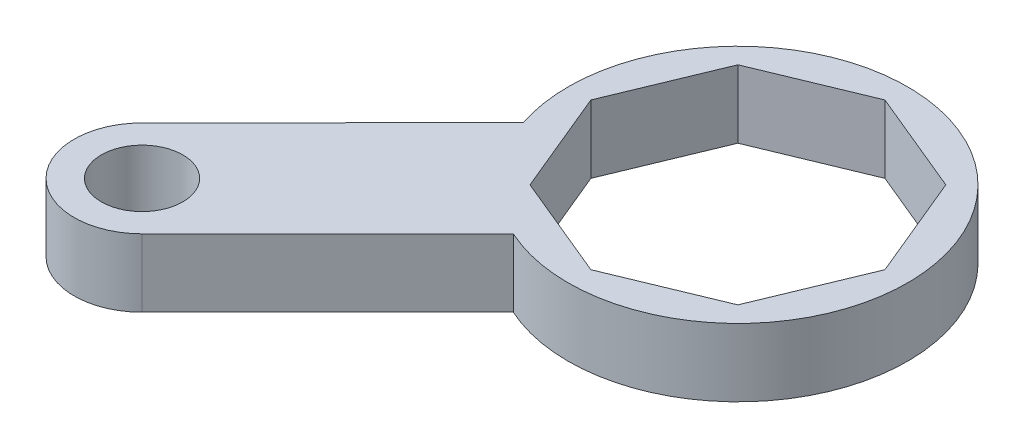
ISO-10303-21;
HEADER;
FILE_DESCRIPTION(('STEP AP214'),'2;1');
FILE_NAME('part.step','',(''),(''),'','','');
FILE_SCHEMA(('AUTOMOTIVE_DESIGN { 1 0 10303 214 1 1 1 1 }'));
ENDSEC;
DATA;
#1=APPLICATION_CONTEXT('core data for automotive mechanical design processes');
#2=APPLICATION_PROTOCOL_DEFINITION('international standard','automotive_design',2000,#1);
#3=PRODUCT_CONTEXT('',#1,'mechanical');
#4=PRODUCT('Part','Part','',(#3));
#5=PRODUCT_RELATED_PRODUCT_CATEGORY('part','',(#4));
#6=PRODUCT_DEFINITION_FORMATION('','',#4);
#7=PRODUCT_DEFINITION_CONTEXT('part definition',#1,'design');
#8=PRODUCT_DEFINITION('design','',#6,#7);
#9=PRODUCT_DEFINITION_SHAPE('','',#8);
#10=(LENGTH_UNIT() NAMED_UNIT(*) SI_UNIT(.MILLI.,.METRE.));
#11=(NAMED_UNIT(*) PLANE_ANGLE_UNIT() SI_UNIT($,.RADIAN.));
#12=(NAMED_UNIT(*) SI_UNIT($,.STERADIAN.) SOLID_ANGLE_UNIT());
#13=UNCERTAINTY_MEASURE_WITH_UNIT(LENGTH_MEASURE(1.E-05),#10,'distance_accuracy_value','');
#14=(GEOMETRIC_REPRESENTATION_CONTEXT(3) GLOBAL_UNCERTAINTY_ASSIGNED_CONTEXT((#13)) GLOBAL_UNIT_ASSIGNED_CONTEXT((#10,
#11,#12)) REPRESENTATION_CONTEXT('',''));
#15=CARTESIAN_POINT('',(0.,0.,0.));
#16=DIRECTION('',(0.,0.,1.));
#17=DIRECTION('',(1.,0.,0.));
#18=AXIS2_PLACEMENT_3D('',#15,#16,#17);
#19=CARTESIAN_POINT('',(-22.3463313526983,5.,21.5224767940391));
#20=DIRECTION('',(0.,1.,0.));
#21=DIRECTION('',(0.,0.,1.));
#22=AXIS2_PLACEMENT_3D('',#19,#20,#21);
#23=PLANE('',#22);
#24=CARTESIAN_POINT('',(-22.3463313526983,5.,21.5224767940391));
#25=DIRECTION('',(0.,1.,0.));
#26=DIRECTION('',(0.,0.,1.));
#27=AXIS2_PLACEMENT_3D('',#24,#25,#26);
#28=CIRCLE('',#27,5.);
#29=CARTESIAN_POINT('',(-25.881865258631,5.,17.9869428881064));
#30=VERTEX_POINT('',#29);
#31=CARTESIAN_POINT('',(-18.8107974467655,5.,25.0580106999718));
#32=VERTEX_POINT('',#31);
#33=EDGE_CURVE('E193',#30,#32,#28,.T.);
#34=ORIENTED_EDGE('',*,*,#33,.T.);
#35=DIRECTION('',(0.707106781186544,0.,-0.707106781186551));
#36=VECTOR('',#35,1.);
#37=CARTESIAN_POINT('',(-18.8107974467655,5.,25.0580106999718));
#38=LINE('',#37,#36);
#39=CARTESIAN_POINT('',(-5.14489273194085,5.,11.392105985147));
#40=VERTEX_POINT('',#39);
#41=EDGE_CURVE('E196',#32,#40,#38,.T.);
#42=ORIENTED_EDGE('',*,*,#41,.T.);
#43=CARTESIAN_POINT('',(0.,5.,0.));
#44=DIRECTION('',(0.,1.,0.));
#45=DIRECTION('',(0.,0.,1.));
#46=AXIS2_PLACEMENT_3D('',#43,#44,#45);
#47=CIRCLE('',#46,12.5);
#48=CARTESIAN_POINT('',(-11.8655283550523,5.,3.93182360431509));
#49=VERTEX_POINT('',#48);
#50=EDGE_CURVE('E199',#40,#49,#47,.T.);
#51=ORIENTED_EDGE('',*,*,#50,.T.);
#52=DIRECTION('',(-0.706129197369623,0.,0.708083015346458));
#53=VECTOR('',#52,1.);
#54=CARTESIAN_POINT('',(-25.881865258631,5.,17.9869428881064));
#55=LINE('',#54,#53);
#56=EDGE_CURVE('E201',#49,#30,#55,.T.);
#57=ORIENTED_EDGE('',*,*,#56,.T.);
#58=EDGE_LOOP('',(#34,#42,#51,#57));
#59=FACE_BOUND('',#58,.T.);
#60=CARTESIAN_POINT('',(-22.3463313526983,5.,21.5224767940391));
#61=DIRECTION('',(0.,1.,0.));
#62=DIRECTION('',(0.,0.,1.));
#63=AXIS2_PLACEMENT_3D('',#60,#61,#62);
#64=CIRCLE('',#63,3.);
#65=CARTESIAN_POINT('',(-22.3463313526983,5.,24.5224767940391));
#66=VERTEX_POINT('',#65);
#67=EDGE_CURVE('E187',#66,#66,#64,.T.);
#68=ORIENTED_EDGE('',*,*,#67,.F.);
#69=EDGE_LOOP('',(#68));
#70=FACE_BOUND('',#69,.T.);
#71=DIRECTION('',(-0.923879532511282,0.,0.382683432365101));
#72=VECTOR('',#71,1.);
#73=CARTESIAN_POINT('',(-1.26216371267626E-13,5.,-10.8239220029239));
#74=LINE('',#73,#72);
#75=CARTESIAN_POINT('',(-1.26216371267626E-13,5.,-10.8239220029239));
#76=VERTEX_POINT('',#75);
#77=CARTESIAN_POINT('',(-7.65366864730188,5.,-7.65366864730171));
#78=VERTEX_POINT('',#77);
#79=EDGE_CURVE('E130',#76,#78,#74,.T.);
#80=ORIENTED_EDGE('',*,*,#79,.F.);
#81=DIRECTION('',(-0.923879532511291,0.,-0.382683432365079));
#82=VECTOR('',#81,1.);
#83=CARTESIAN_POINT('',(7.6536686473017,5.,-7.65366864730189));
#84=LINE('',#83,#82);
#85=CARTESIAN_POINT('',(7.6536686473017,5.,-7.65366864730189));
#86=VERTEX_POINT('',#85);
#87=EDGE_CURVE('E122',#86,#76,#84,.T.);
#88=ORIENTED_EDGE('',*,*,#87,.F.);
#89=DIRECTION('',(-0.3826834323651,0.,-0.923879532511282));
#90=VECTOR('',#89,1.);
#91=CARTESIAN_POINT('',(10.8239220029239,5.,-1.25406399421277E-13));
#92=LINE('',#91,#90);
#93=CARTESIAN_POINT('',(10.8239220029239,5.,-1.2490009027033E-13));
#94=VERTEX_POINT('',#93);
#95=EDGE_CURVE('E155',#94,#86,#92,.T.);
#96=ORIENTED_EDGE('',*,*,#95,.F.);
#97=DIRECTION('',(0.382683432365079,0.,-0.923879532511291));
#98=VECTOR('',#97,1.);
#99=CARTESIAN_POINT('',(7.65366864730188,5.,7.6536686473017));
#100=LINE('',#99,#98);
#101=CARTESIAN_POINT('',(7.65366864730188,5.,7.6536686473017));
#102=VERTEX_POINT('',#101);
#103=EDGE_CURVE('E153',#102,#94,#100,.T.);
#104=ORIENTED_EDGE('',*,*,#103,.F.);
#105=DIRECTION('',(0.923879532511282,0.,-0.3826834323651));
#106=VECTOR('',#105,1.);
#107=CARTESIAN_POINT('',(1.29151413168624E-13,5.,10.8239220029239));
#108=LINE('',#107,#106);
#109=CARTESIAN_POINT('',(1.29151413168624E-13,5.,10.8239220029239));
#110=VERTEX_POINT('',#109);
#111=EDGE_CURVE('E151',#110,#102,#108,.T.);
#112=ORIENTED_EDGE('',*,*,#111,.F.);
#113=DIRECTION('',(0.923879532511292,0.,0.382683432365079));
#114=VECTOR('',#113,1.);
#115=CARTESIAN_POINT('',(-7.65366864730171,5.,7.65366864730188));
#116=LINE('',#115,#114);
#117=CARTESIAN_POINT('',(-7.65366864730171,5.,7.65366864730188));
#118=VERTEX_POINT('',#117);
#119=EDGE_CURVE('E149',#118,#110,#116,.T.);
#120=ORIENTED_EDGE('',*,*,#119,.F.);
#121=DIRECTION('',(0.3826834323651,0.,0.923879532511282));
#122=VECTOR('',#121,1.);
#123=CARTESIAN_POINT('',(-10.8239220029239,5.,1.28316550544672E-13));
#124=LINE('',#123,#122);
#125=CARTESIAN_POINT('',(-10.8239220029239,5.,1.28316550544672E-13));
#126=VERTEX_POINT('',#125);
#127=EDGE_CURVE('E145',#126,#118,#124,.T.);
#128=ORIENTED_EDGE('',*,*,#127,.F.);
#129=DIRECTION('',(-0.382683432365079,0.,0.923879532511291));
#130=VECTOR('',#129,1.);
#131=CARTESIAN_POINT('',(-7.65366864730188,5.,-7.65366864730171));
#132=LINE('',#131,#130);
#133=EDGE_CURVE('E143',#78,#126,#132,.T.);
#134=ORIENTED_EDGE('',*,*,#133,.F.);
#135=EDGE_LOOP('',(#80,#88,#96,#104,#112,#120,#128,#134));
#136=FACE_BOUND('',#135,.T.);
#137=ADVANCED_FACE('F33',(#59,#70,#136),#23,.T.);
#138=CARTESIAN_POINT('',(-22.3463313526983,0.,21.5224767940391));
#139=DIRECTION('',(0.,1.,0.));
#140=DIRECTION('',(0.,0.,1.));
#141=AXIS2_PLACEMENT_3D('',#138,#139,#140);
#142=PLANE('',#141);
#143=CARTESIAN_POINT('',(-22.3463313526983,0.,21.5224767940391));
#144=DIRECTION('',(0.,1.,0.));
#145=DIRECTION('',(0.,0.,1.));
#146=AXIS2_PLACEMENT_3D('',#143,#144,#145);
#147=CIRCLE('',#146,3.);
#148=CARTESIAN_POINT('',(-22.3463313526983,0.,24.5224767940391));
#149=VERTEX_POINT('',#148);
#150=EDGE_CURVE('E138',#149,#149,#147,.T.);
#151=ORIENTED_EDGE('',*,*,#150,.T.);
#152=EDGE_LOOP('',(#151));
#153=FACE_BOUND('',#152,.T.);
#154=CARTESIAN_POINT('',(-22.3463313526983,0.,21.5224767940391));
#155=DIRECTION('',(0.,1.,0.));
#156=DIRECTION('',(0.,0.,1.));
#157=AXIS2_PLACEMENT_3D('',#154,#155,#156);
#158=CIRCLE('',#157,5.);
#159=CARTESIAN_POINT('',(-25.881865258631,0.,17.9869428881064));
#160=VERTEX_POINT('',#159);
#161=CARTESIAN_POINT('',(-18.8107974467655,0.,25.0580106999718));
#162=VERTEX_POINT('',#161);
#163=EDGE_CURVE('E190',#160,#162,#158,.T.);
#164=ORIENTED_EDGE('',*,*,#163,.F.);
#165=DIRECTION('',(-0.706129197369623,0.,0.708083015346458));
#166=VECTOR('',#165,1.);
#167=CARTESIAN_POINT('',(-25.881865258631,0.,17.9869428881064));
#168=LINE('',#167,#166);
#169=CARTESIAN_POINT('',(-11.8655283550523,0.,3.93182360431509));
#170=VERTEX_POINT('',#169);
#171=EDGE_CURVE('E197',#170,#160,#168,.T.);
#172=ORIENTED_EDGE('',*,*,#171,.F.);
#173=CARTESIAN_POINT('',(0.,0.,0.));
#174=DIRECTION('',(0.,1.,0.));
#175=DIRECTION('',(0.,0.,1.));
#176=AXIS2_PLACEMENT_3D('',#173,#174,#175);
#177=CIRCLE('',#176,12.5);
#178=CARTESIAN_POINT('',(-5.14489273194085,0.,11.392105985147));
#179=VERTEX_POINT('',#178);
#180=EDGE_CURVE('E208',#179,#170,#177,.T.);
#181=ORIENTED_EDGE('',*,*,#180,.F.);
#182=DIRECTION('',(0.707106781186544,0.,-0.707106781186551));
#183=VECTOR('',#182,1.);
#184=CARTESIAN_POINT('',(-18.8107974467655,0.,25.0580106999718));
#185=LINE('',#184,#183);
#186=EDGE_CURVE('E206',#162,#179,#185,.T.);
#187=ORIENTED_EDGE('',*,*,#186,.F.);
#188=EDGE_LOOP('',(#164,#172,#181,#187));
#189=FACE_BOUND('',#188,.T.);
#190=DIRECTION('',(-0.923879532511291,0.,-0.382683432365079));
#191=VECTOR('',#190,1.);
#192=CARTESIAN_POINT('',(7.6536686473017,0.,-7.65366864730189));
#193=LINE('',#192,#191);
#194=CARTESIAN_POINT('',(7.65366864730169,0.,-7.65366864730189));
#195=VERTEX_POINT('',#194);
#196=CARTESIAN_POINT('',(-1.26216371267626E-13,0.,-10.8239220029239));
#197=VERTEX_POINT('',#196);
#198=EDGE_CURVE('E56',#195,#197,#193,.T.);
#199=ORIENTED_EDGE('',*,*,#198,.T.);
#200=DIRECTION('',(-0.923879532511282,0.,0.382683432365101));
#201=VECTOR('',#200,1.);
#202=CARTESIAN_POINT('',(-1.26216371267626E-13,0.,-10.8239220029239));
#203=LINE('',#202,#201);
#204=CARTESIAN_POINT('',(-7.65366864730188,0.,-7.65366864730171));
#205=VERTEX_POINT('',#204);
#206=EDGE_CURVE('E137',#197,#205,#203,.T.);
#207=ORIENTED_EDGE('',*,*,#206,.T.);
#208=DIRECTION('',(-0.382683432365079,0.,0.923879532511291));
#209=VECTOR('',#208,1.);
#210=CARTESIAN_POINT('',(-7.65366864730188,0.,-7.65366864730171));
#211=LINE('',#210,#209);
#212=CARTESIAN_POINT('',(-10.8239220029239,0.,1.28316550544672E-13));
#213=VERTEX_POINT('',#212);
#214=EDGE_CURVE('E159',#205,#213,#211,.T.);
#215=ORIENTED_EDGE('',*,*,#214,.T.);
#216=DIRECTION('',(0.3826834323651,0.,0.923879532511282));
#217=VECTOR('',#216,1.);
#218=CARTESIAN_POINT('',(-10.8239220029239,0.,1.28316550544672E-13));
#219=LINE('',#218,#217);
#220=CARTESIAN_POINT('',(-7.65366864730171,0.,7.65366864730188));
#221=VERTEX_POINT('',#220);
#222=EDGE_CURVE('E162',#213,#221,#219,.T.);
#223=ORIENTED_EDGE('',*,*,#222,.T.);
#224=DIRECTION('',(0.923879532511292,0.,0.382683432365079));
#225=VECTOR('',#224,1.);
#226=CARTESIAN_POINT('',(-7.65366864730171,0.,7.65366864730188));
#227=LINE('',#226,#225);
#228=CARTESIAN_POINT('',(1.29151413168624E-13,0.,10.8239220029239));
#229=VERTEX_POINT('',#228);
#230=EDGE_CURVE('E165',#221,#229,#227,.T.);
#231=ORIENTED_EDGE('',*,*,#230,.T.);
#232=DIRECTION('',(0.923879532511282,0.,-0.3826834323651));
#233=VECTOR('',#232,1.);
#234=CARTESIAN_POINT('',(1.29151413168624E-13,0.,10.8239220029239));
#235=LINE('',#234,#233);
#236=CARTESIAN_POINT('',(7.65366864730188,0.,7.6536686473017));
#237=VERTEX_POINT('',#236);
#238=EDGE_CURVE('E168',#229,#237,#235,.T.);
#239=ORIENTED_EDGE('',*,*,#238,.T.);
#240=DIRECTION('',(0.382683432365079,0.,-0.923879532511291));
#241=VECTOR('',#240,1.);
#242=CARTESIAN_POINT('',(7.65366864730188,0.,7.6536686473017));
#243=LINE('',#242,#241);
#244=CARTESIAN_POINT('',(10.8239220029239,0.,-1.25406399421277E-13));
#245=VERTEX_POINT('',#244);
#246=EDGE_CURVE('E171',#237,#245,#243,.T.);
#247=ORIENTED_EDGE('',*,*,#246,.T.);
#248=DIRECTION('',(-0.3826834323651,0.,-0.923879532511282));
#249=VECTOR('',#248,1.);
#250=CARTESIAN_POINT('',(10.8239220029239,0.,-1.25406399421277E-13));
#251=LINE('',#250,#249);
#252=EDGE_CURVE('E131',#245,#195,#251,.T.);
#253=ORIENTED_EDGE('',*,*,#252,.T.);
#254=EDGE_LOOP('',(#199,#207,#215,#223,#231,#239,#247,#253));
#255=FACE_BOUND('',#254,.T.);
#256=ADVANCED_FACE('F226',(#153,#189,#255),#142,.F.);
#257=CARTESIAN_POINT('',(-22.3463313526983,5.,21.5224767940391));
#258=DIRECTION('',(0.,-1.,0.));
#259=DIRECTION('',(0.,0.,-1.));
#260=AXIS2_PLACEMENT_3D('',#257,#258,#259);
#261=CYLINDRICAL_SURFACE('',#260,5.);
#262=ORIENTED_EDGE('',*,*,#163,.T.);
#263=DIRECTION('',(0.,-1.,0.));
#264=VECTOR('',#263,1.);
#265=CARTESIAN_POINT('',(-18.8107974467655,5.,25.0580106999718));
#266=LINE('',#265,#264);
#267=EDGE_CURVE('E11',#32,#162,#266,.T.);
#268=ORIENTED_EDGE('',*,*,#267,.F.);
#269=ORIENTED_EDGE('',*,*,#33,.F.);
#270=DIRECTION('',(0.,-1.,0.));
#271=VECTOR('',#270,1.);
#272=CARTESIAN_POINT('',(-25.881865258631,5.,17.9869428881064));
#273=LINE('',#272,#271);
#274=EDGE_CURVE('E203',#30,#160,#273,.T.);
#275=ORIENTED_EDGE('',*,*,#274,.T.);
#276=EDGE_LOOP('',(#262,#268,#269,#275));
#277=FACE_BOUND('',#276,.T.);
#278=ADVANCED_FACE('F35',(#277),#261,.T.);
#279=CARTESIAN_POINT('',(-18.8107974467655,5.,25.0580106999718));
#280=DIRECTION('',(-0.707106781186551,0.,-0.707106781186544));
#281=DIRECTION('',(-0.707106781186544,0.,0.707106781186551));
#282=AXIS2_PLACEMENT_3D('',#279,#280,#281);
#283=PLANE('',#282);
#284=ORIENTED_EDGE('',*,*,#186,.T.);
#285=DIRECTION('',(0.,-1.,0.));
#286=VECTOR('',#285,1.);
#287=CARTESIAN_POINT('',(-5.14489273194085,5.,11.392105985147));
#288=LINE('',#287,#286);
#289=EDGE_CURVE('E41',#40,#179,#288,.T.);
#290=ORIENTED_EDGE('',*,*,#289,.F.);
#291=ORIENTED_EDGE('',*,*,#41,.F.);
#292=ORIENTED_EDGE('',*,*,#267,.T.);
#293=EDGE_LOOP('',(#284,#290,#291,#292));
#294=FACE_BOUND('',#293,.T.);
#295=ADVANCED_FACE('F237',(#294),#283,.F.);
#296=CARTESIAN_POINT('',(0.,5.,0.));
#297=DIRECTION('',(0.,-1.,0.));
#298=DIRECTION('',(0.,0.,-1.));
#299=AXIS2_PLACEMENT_3D('',#296,#297,#298);
#300=CYLINDRICAL_SURFACE('',#299,12.5);
#301=ORIENTED_EDGE('',*,*,#180,.T.);
#302=DIRECTION('',(0.,-1.,0.));
#303=VECTOR('',#302,1.);
#304=CARTESIAN_POINT('',(-11.8655283550523,5.,3.93182360431509));
#305=LINE('',#304,#303);
#306=EDGE_CURVE('E213',#49,#170,#305,.T.);
#307=ORIENTED_EDGE('',*,*,#306,.F.);
#308=ORIENTED_EDGE('',*,*,#50,.F.);
#309=ORIENTED_EDGE('',*,*,#289,.T.);
#310=EDGE_LOOP('',(#301,#307,#308,#309));
#311=FACE_BOUND('',#310,.T.);
#312=ADVANCED_FACE('F220',(#311),#300,.T.);
#313=CARTESIAN_POINT('',(-25.881865258631,5.,17.9869428881064));
#314=DIRECTION('',(0.708083015346458,0.,0.706129197369623));
#315=DIRECTION('',(0.706129197369623,0.,-0.708083015346458));
#316=AXIS2_PLACEMENT_3D('',#313,#314,#315);
#317=PLANE('',#316);
#318=ORIENTED_EDGE('',*,*,#171,.T.);
#319=ORIENTED_EDGE('',*,*,#274,.F.);
#320=ORIENTED_EDGE('',*,*,#56,.F.);
#321=ORIENTED_EDGE('',*,*,#306,.T.);
#322=EDGE_LOOP('',(#318,#319,#320,#321));
#323=FACE_BOUND('',#322,.T.);
#324=ADVANCED_FACE('F230',(#323),#317,.F.);
#325=CARTESIAN_POINT('',(-22.3463313526983,5.,21.5224767940391));
#326=DIRECTION('',(0.,-1.,0.));
#327=DIRECTION('',(0.,0.,-1.));
#328=AXIS2_PLACEMENT_3D('',#325,#326,#327);
#329=CYLINDRICAL_SURFACE('',#328,3.);
#330=ORIENTED_EDGE('',*,*,#67,.T.);
#331=EDGE_LOOP('',(#330));
#332=FACE_BOUND('',#331,.T.);
#333=ORIENTED_EDGE('',*,*,#150,.F.);
#334=EDGE_LOOP('',(#333));
#335=FACE_BOUND('',#334,.T.);
#336=ADVANCED_FACE('F252',(#332,#335),#329,.F.);
#337=CARTESIAN_POINT('',(7.6536686473017,5.,-7.65366864730189));
#338=DIRECTION('',(-0.382683432365079,0.,0.923879532511291));
#339=DIRECTION('',(0.923879532511291,0.,0.382683432365079));
#340=AXIS2_PLACEMENT_3D('',#337,#338,#339);
#341=PLANE('',#340);
#342=ORIENTED_EDGE('',*,*,#198,.F.);
#343=DIRECTION('',(0.,-1.,0.));
#344=VECTOR('',#343,1.);
#345=CARTESIAN_POINT('',(7.6536686473017,5.,-7.65366864730189));
#346=LINE('',#345,#344);
#347=EDGE_CURVE('E126',#86,#195,#346,.T.);
#348=ORIENTED_EDGE('',*,*,#347,.F.);
#349=ORIENTED_EDGE('',*,*,#87,.T.);
#350=DIRECTION('',(0.,-1.,0.));
#351=VECTOR('',#350,1.);
#352=CARTESIAN_POINT('',(-1.26216371267626E-13,5.,-10.8239220029239));
#353=LINE('',#352,#351);
#354=EDGE_CURVE('E125',#76,#197,#353,.T.);
#355=ORIENTED_EDGE('',*,*,#354,.T.);
#356=EDGE_LOOP('',(#342,#348,#349,#355));
#357=FACE_BOUND('',#356,.T.);
#358=ADVANCED_FACE('F124',(#357),#341,.T.);
#359=CARTESIAN_POINT('',(-1.26216371267626E-13,5.,-10.8239220029239));
#360=DIRECTION('',(0.382683432365101,0.,0.923879532511282));
#361=DIRECTION('',(0.923879532511282,0.,-0.382683432365101));
#362=AXIS2_PLACEMENT_3D('',#359,#360,#361);
#363=PLANE('',#362);
#364=ORIENTED_EDGE('',*,*,#206,.F.);
#365=ORIENTED_EDGE('',*,*,#354,.F.);
#366=ORIENTED_EDGE('',*,*,#79,.T.);
#367=DIRECTION('',(0.,-1.,0.));
#368=VECTOR('',#367,1.);
#369=CARTESIAN_POINT('',(-7.65366864730188,5.,-7.65366864730171));
#370=LINE('',#369,#368);
#371=EDGE_CURVE('E139',#78,#205,#370,.T.);
#372=ORIENTED_EDGE('',*,*,#371,.T.);
#373=EDGE_LOOP('',(#364,#365,#366,#372));
#374=FACE_BOUND('',#373,.T.);
#375=ADVANCED_FACE('F134',(#374),#363,.T.);
#376=CARTESIAN_POINT('',(-7.65366864730188,5.,-7.65366864730171));
#377=DIRECTION('',(0.923879532511291,0.,0.382683432365079));
#378=DIRECTION('',(0.382683432365079,0.,-0.923879532511292));
#379=AXIS2_PLACEMENT_3D('',#376,#377,#378);
#380=PLANE('',#379);
#381=ORIENTED_EDGE('',*,*,#214,.F.);
#382=ORIENTED_EDGE('',*,*,#371,.F.);
#383=ORIENTED_EDGE('',*,*,#133,.T.);
#384=DIRECTION('',(0.,-1.,0.));
#385=VECTOR('',#384,1.);
#386=CARTESIAN_POINT('',(-10.8239220029239,5.,1.28316550544672E-13));
#387=LINE('',#386,#385);
#388=EDGE_CURVE('E184',#126,#213,#387,.T.);
#389=ORIENTED_EDGE('',*,*,#388,.T.);
#390=EDGE_LOOP('',(#381,#382,#383,#389));
#391=FACE_BOUND('',#390,.T.);
#392=ADVANCED_FACE('F269',(#391),#380,.T.);
#393=CARTESIAN_POINT('',(-10.8239220029239,5.,1.28316550544672E-13));
#394=DIRECTION('',(0.923879532511282,0.,-0.3826834323651));
#395=DIRECTION('',(-0.3826834323651,0.,-0.923879532511282));
#396=AXIS2_PLACEMENT_3D('',#393,#394,#395);
#397=PLANE('',#396);
#398=ORIENTED_EDGE('',*,*,#222,.F.);
#399=ORIENTED_EDGE('',*,*,#388,.F.);
#400=ORIENTED_EDGE('',*,*,#127,.T.);
#401=DIRECTION('',(0.,-1.,0.));
#402=VECTOR('',#401,1.);
#403=CARTESIAN_POINT('',(-7.65366864730171,5.,7.65366864730188));
#404=LINE('',#403,#402);
#405=EDGE_CURVE('E182',#118,#221,#404,.T.);
#406=ORIENTED_EDGE('',*,*,#405,.T.);
#407=EDGE_LOOP('',(#398,#399,#400,#406));
#408=FACE_BOUND('',#407,.T.);
#409=ADVANCED_FACE('F274',(#408),#397,.T.);
#410=CARTESIAN_POINT('',(-7.65366864730171,5.,7.65366864730188));
#411=DIRECTION('',(0.382683432365079,0.,-0.923879532511291));
#412=DIRECTION('',(-0.923879532511291,0.,-0.382683432365079));
#413=AXIS2_PLACEMENT_3D('',#410,#411,#412);
#414=PLANE('',#413);
#415=ORIENTED_EDGE('',*,*,#230,.F.);
#416=ORIENTED_EDGE('',*,*,#405,.F.);
#417=ORIENTED_EDGE('',*,*,#119,.T.);
#418=DIRECTION('',(0.,-1.,0.));
#419=VECTOR('',#418,1.);
#420=CARTESIAN_POINT('',(1.29151413168624E-13,5.,10.8239220029239));
#421=LINE('',#420,#419);
#422=EDGE_CURVE('E180',#110,#229,#421,.T.);
#423=ORIENTED_EDGE('',*,*,#422,.T.);
#424=EDGE_LOOP('',(#415,#416,#417,#423));
#425=FACE_BOUND('',#424,.T.);
#426=ADVANCED_FACE('F278',(#425),#414,.T.);
#427=CARTESIAN_POINT('',(1.29151413168624E-13,5.,10.8239220029239));
#428=DIRECTION('',(-0.3826834323651,0.,-0.923879532511282));
#429=DIRECTION('',(-0.923879532511283,0.,0.382683432365101));
#430=AXIS2_PLACEMENT_3D('',#427,#428,#429);
#431=PLANE('',#430);
#432=ORIENTED_EDGE('',*,*,#238,.F.);
#433=ORIENTED_EDGE('',*,*,#422,.F.);
#434=ORIENTED_EDGE('',*,*,#111,.T.);
#435=DIRECTION('',(0.,-1.,0.));
#436=VECTOR('',#435,1.);
#437=CARTESIAN_POINT('',(7.65366864730188,5.,7.6536686473017));
#438=LINE('',#437,#436);
#439=EDGE_CURVE('E178',#102,#237,#438,.T.);
#440=ORIENTED_EDGE('',*,*,#439,.T.);
#441=EDGE_LOOP('',(#432,#433,#434,#440));
#442=FACE_BOUND('',#441,.T.);
#443=ADVANCED_FACE('F282',(#442),#431,.T.);
#444=CARTESIAN_POINT('',(7.65366864730188,5.,7.6536686473017));
#445=DIRECTION('',(-0.923879532511291,0.,-0.382683432365079));
#446=DIRECTION('',(-0.382683432365079,0.,0.923879532511291));
#447=AXIS2_PLACEMENT_3D('',#444,#445,#446);
#448=PLANE('',#447);
#449=ORIENTED_EDGE('',*,*,#246,.F.);
#450=ORIENTED_EDGE('',*,*,#439,.F.);
#451=ORIENTED_EDGE('',*,*,#103,.T.);
#452=DIRECTION('',(0.,-1.,0.));
#453=VECTOR('',#452,1.);
#454=CARTESIAN_POINT('',(10.8239220029239,5.,-1.25406399421277E-13));
#455=LINE('',#454,#453);
#456=EDGE_CURVE('E48',#94,#245,#455,.T.);
#457=ORIENTED_EDGE('',*,*,#456,.T.);
#458=EDGE_LOOP('',(#449,#450,#451,#457));
#459=FACE_BOUND('',#458,.T.);
#460=ADVANCED_FACE('F286',(#459),#448,.T.);
#461=CARTESIAN_POINT('',(10.8239220029239,5.,-1.25406399421277E-13));
#462=DIRECTION('',(-0.923879532511282,0.,0.3826834323651));
#463=DIRECTION('',(0.3826834323651,0.,0.923879532511283));
#464=AXIS2_PLACEMENT_3D('',#461,#462,#463);
#465=PLANE('',#464);
#466=ORIENTED_EDGE('',*,*,#252,.F.);
#467=ORIENTED_EDGE('',*,*,#456,.F.);
#468=ORIENTED_EDGE('',*,*,#95,.T.);
#469=ORIENTED_EDGE('',*,*,#347,.T.);
#470=EDGE_LOOP('',(#466,#467,#468,#469));
#471=FACE_BOUND('',#470,.T.);
#472=ADVANCED_FACE('F290',(#471),#465,.T.);
#473=CLOSED_SHELL('',(#137,#256,#278,#295,#312,#324,#336,#358,#375,#392,#409,#426,#443,#460,#472));
#474=MANIFOLD_SOLID_BREP('B2',#473);
#475=ADVANCED_BREP_SHAPE_REPRESENTATION('',(#18,#474),#14);
#476=SHAPE_DEFINITION_REPRESENTATION(#9,#475);
ENDSEC;
END-ISO-10303-21;
